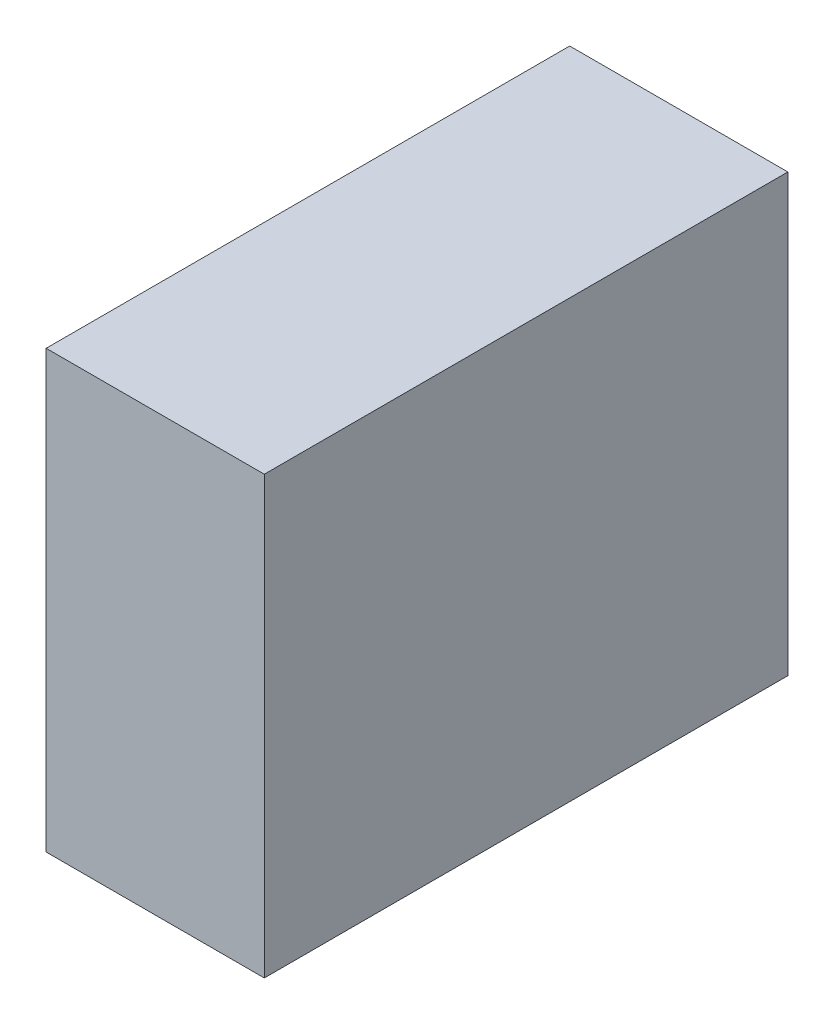
ISO-10303-21;
HEADER;
FILE_DESCRIPTION(('STEP AP214'),'2;1');
FILE_NAME('part.step','',(''),(''),'','','');
FILE_SCHEMA(('AUTOMOTIVE_DESIGN { 1 0 10303 214 1 1 1 1 }'));
ENDSEC;
DATA;
#1=APPLICATION_CONTEXT('core data for automotive mechanical design processes');
#2=APPLICATION_PROTOCOL_DEFINITION('international standard','automotive_design',2000,#1);
#3=PRODUCT_CONTEXT('',#1,'mechanical');
#4=PRODUCT('Part','Part','',(#3));
#5=PRODUCT_RELATED_PRODUCT_CATEGORY('part','',(#4));
#6=PRODUCT_DEFINITION_FORMATION('','',#4);
#7=PRODUCT_DEFINITION_CONTEXT('part definition',#1,'design');
#8=PRODUCT_DEFINITION('design','',#6,#7);
#9=PRODUCT_DEFINITION_SHAPE('','',#8);
#10=(LENGTH_UNIT() NAMED_UNIT(*) SI_UNIT(.MILLI.,.METRE.));
#11=(NAMED_UNIT(*) PLANE_ANGLE_UNIT() SI_UNIT($,.RADIAN.));
#12=(NAMED_UNIT(*) SI_UNIT($,.STERADIAN.) SOLID_ANGLE_UNIT());
#13=UNCERTAINTY_MEASURE_WITH_UNIT(LENGTH_MEASURE(1.E-05),#10,'distance_accuracy_value','');
#14=(GEOMETRIC_REPRESENTATION_CONTEXT(3) GLOBAL_UNCERTAINTY_ASSIGNED_CONTEXT((#13)) GLOBAL_UNIT_ASSIGNED_CONTEXT((#10,
#11,#12)) REPRESENTATION_CONTEXT('',''));
#15=CARTESIAN_POINT('',(0.,0.,0.));
#16=DIRECTION('',(0.,0.,1.));
#17=DIRECTION('',(1.,0.,0.));
#18=AXIS2_PLACEMENT_3D('',#15,#16,#17);
#19=CARTESIAN_POINT('',(300.,200.,-248.));
#20=DIRECTION('',(-1.,0.,0.));
#21=DIRECTION('',(0.,0.,1.));
#22=AXIS2_PLACEMENT_3D('',#19,#20,#21);
#23=PLANE('',#22);
#24=DIRECTION('',(0.,-1.,0.));
#25=VECTOR('',#24,1.);
#26=CARTESIAN_POINT('',(300.,200.,-128.));
#27=LINE('',#26,#25);
#28=CARTESIAN_POINT('',(300.,300.,-128.));
#29=VERTEX_POINT('',#28);
#30=CARTESIAN_POINT('',(300.,200.,-128.));
#31=VERTEX_POINT('',#30);
#32=EDGE_CURVE('E103',#29,#31,#27,.T.);
#33=ORIENTED_EDGE('',*,*,#32,.F.);
#34=DIRECTION('',(0.,0.,1.));
#35=VECTOR('',#34,1.);
#36=CARTESIAN_POINT('',(300.,300.,-248.));
#37=LINE('',#36,#35);
#38=CARTESIAN_POINT('',(300.,300.,-248.));
#39=VERTEX_POINT('',#38);
#40=EDGE_CURVE('E11',#39,#29,#37,.T.);
#41=ORIENTED_EDGE('',*,*,#40,.F.);
#42=DIRECTION('',(0.,-1.,0.));
#43=VECTOR('',#42,1.);
#44=CARTESIAN_POINT('',(300.,200.,-248.));
#45=LINE('',#44,#43);
#46=CARTESIAN_POINT('',(300.,200.,-248.));
#47=VERTEX_POINT('',#46);
#48=EDGE_CURVE('E97',#39,#47,#45,.T.);
#49=ORIENTED_EDGE('',*,*,#48,.T.);
#50=DIRECTION('',(0.,0.,1.));
#51=VECTOR('',#50,1.);
#52=CARTESIAN_POINT('',(300.,200.,-248.));
#53=LINE('',#52,#51);
#54=EDGE_CURVE('E42',#47,#31,#53,.T.);
#55=ORIENTED_EDGE('',*,*,#54,.T.);
#56=EDGE_LOOP('',(#33,#41,#49,#55));
#57=FACE_BOUND('',#56,.T.);
#58=ADVANCED_FACE('F39',(#57),#23,.T.);
#59=CARTESIAN_POINT('',(300.,300.,-248.));
#60=DIRECTION('',(0.,1.,0.));
#61=DIRECTION('',(0.,0.,1.));
#62=AXIS2_PLACEMENT_3D('',#59,#60,#61);
#63=PLANE('',#62);
#64=DIRECTION('',(-1.,0.,0.));
#65=VECTOR('',#64,1.);
#66=CARTESIAN_POINT('',(300.,300.,-128.));
#67=LINE('',#66,#65);
#68=CARTESIAN_POINT('',(350.,300.,-128.));
#69=VERTEX_POINT('',#68);
#70=EDGE_CURVE('E99',#69,#29,#67,.T.);
#71=ORIENTED_EDGE('',*,*,#70,.F.);
#72=DIRECTION('',(0.,0.,1.));
#73=VECTOR('',#72,1.);
#74=CARTESIAN_POINT('',(350.,300.,-248.));
#75=LINE('',#74,#73);
#76=CARTESIAN_POINT('',(350.,300.,-248.));
#77=VERTEX_POINT('',#76);
#78=EDGE_CURVE('E48',#77,#69,#75,.T.);
#79=ORIENTED_EDGE('',*,*,#78,.F.);
#80=DIRECTION('',(-1.,0.,0.));
#81=VECTOR('',#80,1.);
#82=CARTESIAN_POINT('',(300.,300.,-248.));
#83=LINE('',#82,#81);
#84=EDGE_CURVE('E94',#77,#39,#83,.T.);
#85=ORIENTED_EDGE('',*,*,#84,.T.);
#86=ORIENTED_EDGE('',*,*,#40,.T.);
#87=EDGE_LOOP('',(#71,#79,#85,#86));
#88=FACE_BOUND('',#87,.T.);
#89=ADVANCED_FACE('F113',(#88),#63,.T.);
#90=CARTESIAN_POINT('',(350.,200.,-248.));
#91=DIRECTION('',(1.,0.,0.));
#92=DIRECTION('',(0.,0.,-1.));
#93=AXIS2_PLACEMENT_3D('',#90,#91,#92);
#94=PLANE('',#93);
#95=DIRECTION('',(0.,1.,0.));
#96=VECTOR('',#95,1.);
#97=CARTESIAN_POINT('',(350.,200.,-128.));
#98=LINE('',#97,#96);
#99=CARTESIAN_POINT('',(350.,200.,-128.));
#100=VERTEX_POINT('',#99);
#101=EDGE_CURVE('E89',#100,#69,#98,.T.);
#102=ORIENTED_EDGE('',*,*,#101,.F.);
#103=DIRECTION('',(0.,0.,1.));
#104=VECTOR('',#103,1.);
#105=CARTESIAN_POINT('',(350.,200.,-248.));
#106=LINE('',#105,#104);
#107=CARTESIAN_POINT('',(350.,200.,-248.));
#108=VERTEX_POINT('',#107);
#109=EDGE_CURVE('E84',#108,#100,#106,.T.);
#110=ORIENTED_EDGE('',*,*,#109,.F.);
#111=DIRECTION('',(0.,1.,0.));
#112=VECTOR('',#111,1.);
#113=CARTESIAN_POINT('',(350.,200.,-248.));
#114=LINE('',#113,#112);
#115=EDGE_CURVE('E87',#108,#77,#114,.T.);
#116=ORIENTED_EDGE('',*,*,#115,.T.);
#117=ORIENTED_EDGE('',*,*,#78,.T.);
#118=EDGE_LOOP('',(#102,#110,#116,#117));
#119=FACE_BOUND('',#118,.T.);
#120=ADVANCED_FACE('F86',(#119),#94,.T.);
#121=CARTESIAN_POINT('',(300.,200.,-248.));
#122=DIRECTION('',(0.,-1.,0.));
#123=DIRECTION('',(0.,0.,-1.));
#124=AXIS2_PLACEMENT_3D('',#121,#122,#123);
#125=PLANE('',#124);
#126=DIRECTION('',(1.,0.,0.));
#127=VECTOR('',#126,1.);
#128=CARTESIAN_POINT('',(300.,200.,-128.));
#129=LINE('',#128,#127);
#130=EDGE_CURVE('E106',#31,#100,#129,.T.);
#131=ORIENTED_EDGE('',*,*,#130,.F.);
#132=ORIENTED_EDGE('',*,*,#54,.F.);
#133=DIRECTION('',(1.,0.,0.));
#134=VECTOR('',#133,1.);
#135=CARTESIAN_POINT('',(300.,200.,-248.));
#136=LINE('',#135,#134);
#137=EDGE_CURVE('E93',#47,#108,#136,.T.);
#138=ORIENTED_EDGE('',*,*,#137,.T.);
#139=ORIENTED_EDGE('',*,*,#109,.T.);
#140=EDGE_LOOP('',(#131,#132,#138,#139));
#141=FACE_BOUND('',#140,.T.);
#142=ADVANCED_FACE('F96',(#141),#125,.T.);
#143=CARTESIAN_POINT('',(0.,0.,-248.));
#144=DIRECTION('',(0.,0.,-1.));
#145=DIRECTION('',(-1.,0.,0.));
#146=AXIS2_PLACEMENT_3D('',#143,#144,#145);
#147=PLANE('',#146);
#148=ORIENTED_EDGE('',*,*,#48,.F.);
#149=ORIENTED_EDGE('',*,*,#84,.F.);
#150=ORIENTED_EDGE('',*,*,#115,.F.);
#151=ORIENTED_EDGE('',*,*,#137,.F.);
#152=EDGE_LOOP('',(#148,#149,#150,#151));
#153=FACE_BOUND('',#152,.T.);
#154=ADVANCED_FACE('F92',(#153),#147,.T.);
#155=CARTESIAN_POINT('',(0.,0.,-128.));
#156=DIRECTION('',(0.,0.,-1.));
#157=DIRECTION('',(-1.,0.,0.));
#158=AXIS2_PLACEMENT_3D('',#155,#156,#157);
#159=PLANE('',#158);
#160=ORIENTED_EDGE('',*,*,#32,.T.);
#161=ORIENTED_EDGE('',*,*,#130,.T.);
#162=ORIENTED_EDGE('',*,*,#101,.T.);
#163=ORIENTED_EDGE('',*,*,#70,.T.);
#164=EDGE_LOOP('',(#160,#161,#162,#163));
#165=FACE_BOUND('',#164,.T.);
#166=ADVANCED_FACE('F112',(#165),#159,.F.);
#167=CLOSED_SHELL('',(#58,#89,#120,#142,#154,#166));
#168=MANIFOLD_SOLID_BREP('B2',#167);
#169=ADVANCED_BREP_SHAPE_REPRESENTATION('',(#18,#168),#14);
#170=SHAPE_DEFINITION_REPRESENTATION(#9,#169);
ENDSEC;
END-ISO-10303-21;
